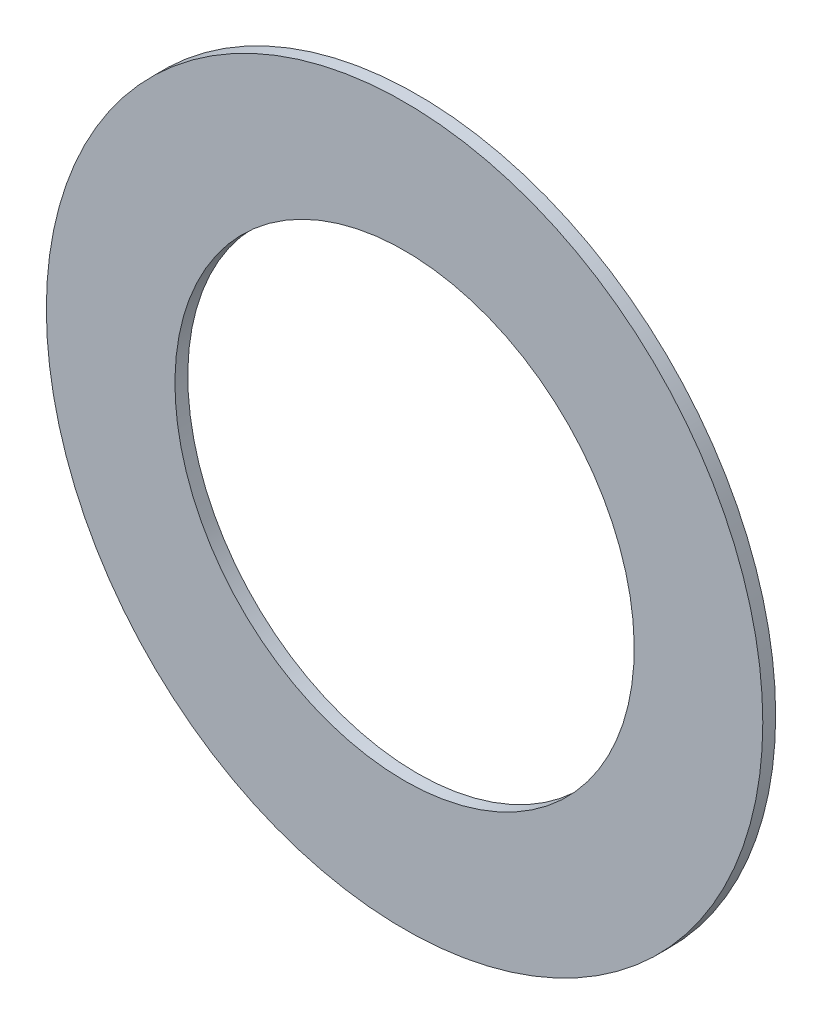
ISO-10303-21;
HEADER;
FILE_DESCRIPTION(('STEP AP214'),'2;1');
FILE_NAME('part.step','',(''),(''),'','','');
FILE_SCHEMA(('AUTOMOTIVE_DESIGN { 1 0 10303 214 1 1 1 1 }'));
ENDSEC;
DATA;
#1=APPLICATION_CONTEXT('core data for automotive mechanical design processes');
#2=APPLICATION_PROTOCOL_DEFINITION('international standard','automotive_design',2000,#1);
#3=PRODUCT_CONTEXT('',#1,'mechanical');
#4=PRODUCT('Part','Part','',(#3));
#5=PRODUCT_RELATED_PRODUCT_CATEGORY('part','',(#4));
#6=PRODUCT_DEFINITION_FORMATION('','',#4);
#7=PRODUCT_DEFINITION_CONTEXT('part definition',#1,'design');
#8=PRODUCT_DEFINITION('design','',#6,#7);
#9=PRODUCT_DEFINITION_SHAPE('','',#8);
#10=(LENGTH_UNIT() NAMED_UNIT(*) SI_UNIT(.MILLI.,.METRE.));
#11=(NAMED_UNIT(*) PLANE_ANGLE_UNIT() SI_UNIT($,.RADIAN.));
#12=(NAMED_UNIT(*) SI_UNIT($,.STERADIAN.) SOLID_ANGLE_UNIT());
#13=UNCERTAINTY_MEASURE_WITH_UNIT(LENGTH_MEASURE(1.E-05),#10,'distance_accuracy_value','');
#14=(GEOMETRIC_REPRESENTATION_CONTEXT(3) GLOBAL_UNCERTAINTY_ASSIGNED_CONTEXT((#13)) GLOBAL_UNIT_ASSIGNED_CONTEXT((#10,
#11,#12)) REPRESENTATION_CONTEXT('',''));
#15=CARTESIAN_POINT('',(0.,0.,0.));
#16=DIRECTION('',(0.,0.,1.));
#17=DIRECTION('',(1.,0.,0.));
#18=AXIS2_PLACEMENT_3D('',#15,#16,#17);
#19=CARTESIAN_POINT('',(79.99,-79.59,-0.045));
#20=DIRECTION('',(0.,0.,-1.));
#21=DIRECTION('',(0.,-1.,0.));
#22=AXIS2_PLACEMENT_3D('',#19,#20,#21);
#23=CYLINDRICAL_SURFACE('',#22,0.625);
#24=CARTESIAN_POINT('',(79.99,-79.59,-0.035));
#25=DIRECTION('',(0.,0.,-1.));
#26=DIRECTION('',(0.,-1.,0.));
#27=AXIS2_PLACEMENT_3D('',#24,#25,#26);
#28=CIRCLE('',#27,0.625);
#29=CARTESIAN_POINT('',(79.99,-80.215,-0.035));
#30=VERTEX_POINT('',#29);
#31=EDGE_CURVE('E27',#30,#30,#28,.T.);
#32=ORIENTED_EDGE('',*,*,#31,.T.);
#33=DIRECTION('',(0.,0.,1.));
#34=VECTOR('',#33,1.);
#35=CARTESIAN_POINT('',(79.99,-80.215,-0.045));
#36=LINE('',#35,#34);
#37=CARTESIAN_POINT('',(79.99,-80.215,0.));
#38=VERTEX_POINT('',#37);
#39=EDGE_CURVE('E11',#30,#38,#36,.T.);
#40=ORIENTED_EDGE('',*,*,#39,.T.);
#41=CARTESIAN_POINT('',(79.99,-79.59,0.));
#42=DIRECTION('',(0.,0.,-1.));
#43=DIRECTION('',(0.,-1.,0.));
#44=AXIS2_PLACEMENT_3D('',#41,#42,#43);
#45=CIRCLE('',#44,0.625);
#46=EDGE_CURVE('E20',#38,#38,#45,.T.);
#47=ORIENTED_EDGE('',*,*,#46,.F.);
#48=ORIENTED_EDGE('',*,*,#39,.F.);
#49=EDGE_LOOP('',(#32,#40,#47,#48));
#50=FACE_BOUND('',#49,.T.);
#51=ADVANCED_FACE('F17',(#50),#23,.F.);
#52=CARTESIAN_POINT('',(79.99,-79.59,-0.035));
#53=DIRECTION('',(0.,0.,1.));
#54=DIRECTION('',(1.,0.,0.));
#55=AXIS2_PLACEMENT_3D('',#52,#53,#54);
#56=PLANE('',#55);
#57=ORIENTED_EDGE('',*,*,#31,.F.);
#58=EDGE_LOOP('',(#57));
#59=FACE_BOUND('',#58,.T.);
#60=CARTESIAN_POINT('',(79.99,-79.59,-0.035));
#61=DIRECTION('',(0.,0.,1.));
#62=DIRECTION('',(1.,0.,0.));
#63=AXIS2_PLACEMENT_3D('',#60,#61,#62);
#64=CIRCLE('',#63,0.975);
#65=CARTESIAN_POINT('',(80.965,-79.59,-0.035));
#66=VERTEX_POINT('',#65);
#67=EDGE_CURVE('E50',#66,#66,#64,.T.);
#68=ORIENTED_EDGE('',*,*,#67,.F.);
#69=EDGE_LOOP('',(#68));
#70=FACE_BOUND('',#69,.T.);
#71=ADVANCED_FACE('F73',(#59,#70),#56,.F.);
#72=CARTESIAN_POINT('',(79.99,-79.59,0.));
#73=DIRECTION('',(0.,0.,1.));
#74=DIRECTION('',(1.,0.,0.));
#75=AXIS2_PLACEMENT_3D('',#72,#73,#74);
#76=PLANE('',#75);
#77=ORIENTED_EDGE('',*,*,#46,.T.);
#78=EDGE_LOOP('',(#77));
#79=FACE_BOUND('',#78,.T.);
#80=CARTESIAN_POINT('',(79.99,-79.59,0.));
#81=DIRECTION('',(0.,0.,1.));
#82=DIRECTION('',(1.,0.,0.));
#83=AXIS2_PLACEMENT_3D('',#80,#81,#82);
#84=CIRCLE('',#83,0.975);
#85=CARTESIAN_POINT('',(80.965,-79.59,0.));
#86=VERTEX_POINT('',#85);
#87=EDGE_CURVE('E63',#86,#86,#84,.T.);
#88=ORIENTED_EDGE('',*,*,#87,.T.);
#89=EDGE_LOOP('',(#88));
#90=FACE_BOUND('',#89,.T.);
#91=ADVANCED_FACE('F75',(#79,#90),#76,.T.);
#92=CARTESIAN_POINT('',(79.99,-79.59,-0.035));
#93=DIRECTION('',(0.,0.,1.));
#94=DIRECTION('',(1.,0.,0.));
#95=AXIS2_PLACEMENT_3D('',#92,#93,#94);
#96=CYLINDRICAL_SURFACE('',#95,0.975);
#97=ORIENTED_EDGE('',*,*,#87,.F.);
#98=DIRECTION('',(0.,0.,1.));
#99=VECTOR('',#98,1.);
#100=CARTESIAN_POINT('',(80.965,-79.59,-0.035));
#101=LINE('',#100,#99);
#102=EDGE_CURVE('E53',#66,#86,#101,.T.);
#103=ORIENTED_EDGE('',*,*,#102,.F.);
#104=ORIENTED_EDGE('',*,*,#67,.T.);
#105=ORIENTED_EDGE('',*,*,#102,.T.);
#106=EDGE_LOOP('',(#97,#103,#104,#105));
#107=FACE_BOUND('',#106,.T.);
#108=ADVANCED_FACE('F52',(#107),#96,.T.);
#109=CLOSED_SHELL('',(#51,#71,#91,#108));
#110=MANIFOLD_SOLID_BREP('B1',#109);
#111=ADVANCED_BREP_SHAPE_REPRESENTATION('',(#18,#110),#14);
#112=SHAPE_DEFINITION_REPRESENTATION(#9,#111);
ENDSEC;
END-ISO-10303-21;
